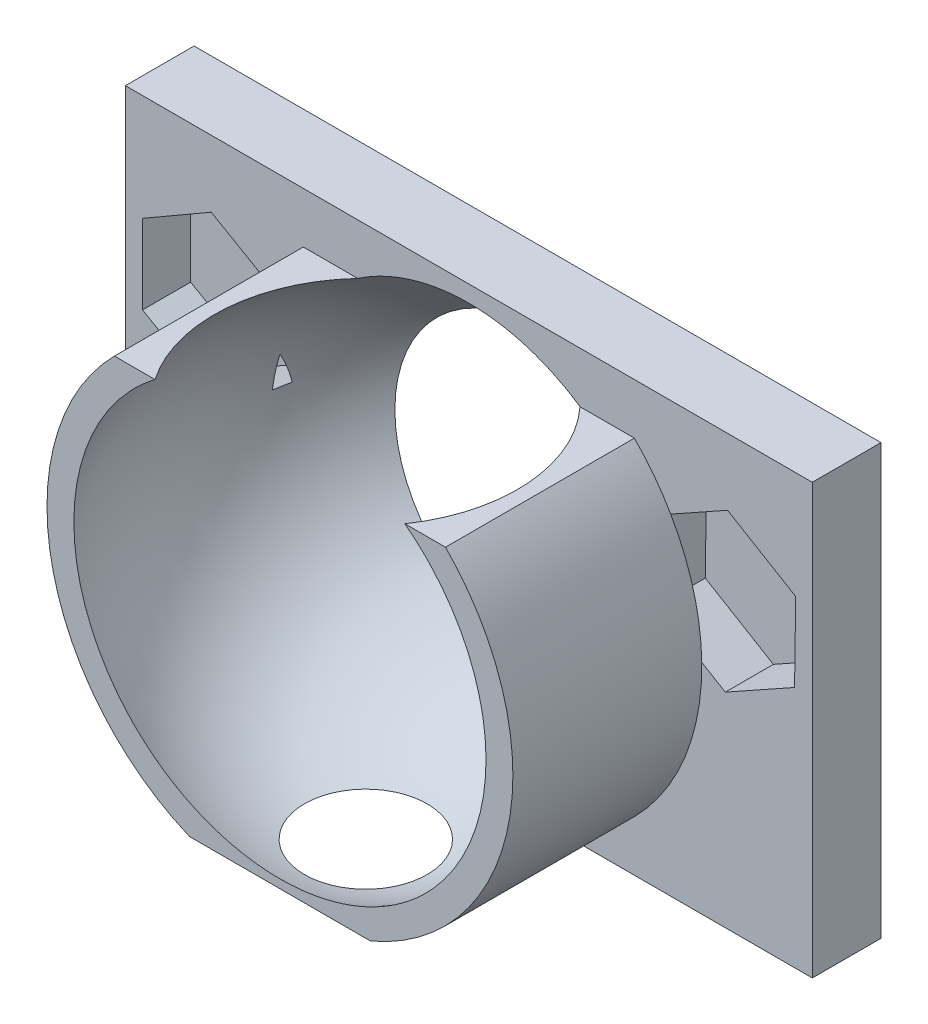
ISO-10303-21;
HEADER;
FILE_DESCRIPTION(('STEP AP214'),'2;1');
FILE_NAME('part.step','',(''),(''),'','','');
FILE_SCHEMA(('AUTOMOTIVE_DESIGN { 1 0 10303 214 1 1 1 1 }'));
ENDSEC;
DATA;
#1=APPLICATION_CONTEXT('core data for automotive mechanical design processes');
#2=APPLICATION_PROTOCOL_DEFINITION('international standard','automotive_design',2000,#1);
#3=PRODUCT_CONTEXT('',#1,'mechanical');
#4=PRODUCT('Part','Part','',(#3));
#5=PRODUCT_RELATED_PRODUCT_CATEGORY('part','',(#4));
#6=PRODUCT_DEFINITION_FORMATION('','',#4);
#7=PRODUCT_DEFINITION_CONTEXT('part definition',#1,'design');
#8=PRODUCT_DEFINITION('design','',#6,#7);
#9=PRODUCT_DEFINITION_SHAPE('','',#8);
#10=(LENGTH_UNIT() NAMED_UNIT(*) SI_UNIT(.MILLI.,.METRE.));
#11=(NAMED_UNIT(*) PLANE_ANGLE_UNIT() SI_UNIT($,.RADIAN.));
#12=(NAMED_UNIT(*) SI_UNIT($,.STERADIAN.) SOLID_ANGLE_UNIT());
#13=UNCERTAINTY_MEASURE_WITH_UNIT(LENGTH_MEASURE(1.E-05),#10,'distance_accuracy_value','');
#14=(GEOMETRIC_REPRESENTATION_CONTEXT(3) GLOBAL_UNCERTAINTY_ASSIGNED_CONTEXT((#13)) GLOBAL_UNIT_ASSIGNED_CONTEXT((#10,
#11,#12)) REPRESENTATION_CONTEXT('',''));
#15=CARTESIAN_POINT('',(0.,0.,0.));
#16=DIRECTION('',(0.,0.,1.));
#17=DIRECTION('',(1.,0.,0.));
#18=AXIS2_PLACEMENT_3D('',#15,#16,#17);
#19=CARTESIAN_POINT('',(29.6392056496232,22.0438836143508,15.));
#20=DIRECTION('',(0.,-1.,0.));
#21=DIRECTION('',(1.,0.,0.));
#22=AXIS2_PLACEMENT_3D('',#19,#20,#21);
#23=PLANE('',#22);
#24=DIRECTION('',(-1.,0.,0.));
#25=VECTOR('',#24,1.);
#26=CARTESIAN_POINT('',(29.6392056496232,22.0438836143508,15.));
#27=LINE('',#26,#25);
#28=CARTESIAN_POINT('',(12.7257793849975,22.0438836143508,15.));
#29=VERTEX_POINT('',#28);
#30=CARTESIAN_POINT('',(10.3607943503768,22.0438836143508,15.));
#31=VERTEX_POINT('',#30);
#32=EDGE_CURVE('E401',#29,#31,#27,.T.);
#33=ORIENTED_EDGE('',*,*,#32,.F.);
#34=CARTESIAN_POINT('',(20.,22.0438836143508,10.));
#35=DIRECTION('',(0.,-1.,0.));
#36=DIRECTION('',(1.,0.,0.));
#37=AXIS2_PLACEMENT_3D('',#34,#35,#36);
#38=CIRCLE('',#37,8.82690690761647);
#39=CARTESIAN_POINT('',(13.5258756919775,22.0438836143508,4.));
#40=VERTEX_POINT('',#39);
#41=EDGE_CURVE('E11',#29,#40,#38,.T.);
#42=ORIENTED_EDGE('',*,*,#41,.T.);
#43=DIRECTION('',(-1.,0.,0.));
#44=VECTOR('',#43,1.);
#45=CARTESIAN_POINT('',(29.6392056496232,22.0438836143508,4.));
#46=LINE('',#45,#44);
#47=CARTESIAN_POINT('',(10.3607943503768,22.0438836143508,4.));
#48=VERTEX_POINT('',#47);
#49=EDGE_CURVE('E224',#40,#48,#46,.T.);
#50=ORIENTED_EDGE('',*,*,#49,.T.);
#51=DIRECTION('',(0.,0.,-1.));
#52=VECTOR('',#51,1.);
#53=CARTESIAN_POINT('',(10.3607943503768,22.0438836143508,15.));
#54=LINE('',#53,#52);
#55=EDGE_CURVE('E240',#31,#48,#54,.T.);
#56=ORIENTED_EDGE('',*,*,#55,.F.);
#57=EDGE_LOOP('',(#33,#42,#50,#56));
#58=FACE_BOUND('',#57,.T.);
#59=ADVANCED_FACE('F35',(#58),#23,.F.);
#60=CARTESIAN_POINT('',(0.,0.,4.));
#61=DIRECTION('',(1.,0.,0.));
#62=DIRECTION('',(0.,0.,-1.));
#63=AXIS2_PLACEMENT_3D('',#60,#61,#62);
#64=PLANE('',#63);
#65=DIRECTION('',(0.,-1.,0.));
#66=VECTOR('',#65,1.);
#67=CARTESIAN_POINT('',(0.,0.,0.));
#68=LINE('',#67,#66);
#69=CARTESIAN_POINT('',(0.,25.,0.));
#70=VERTEX_POINT('',#69);
#71=CARTESIAN_POINT('',(0.,0.,0.));
#72=VERTEX_POINT('',#71);
#73=EDGE_CURVE('E292',#70,#72,#68,.T.);
#74=ORIENTED_EDGE('',*,*,#73,.T.);
#75=DIRECTION('',(0.,0.,-1.));
#76=VECTOR('',#75,1.);
#77=CARTESIAN_POINT('',(0.,0.,4.));
#78=LINE('',#77,#76);
#79=CARTESIAN_POINT('',(0.,0.,4.));
#80=VERTEX_POINT('',#79);
#81=EDGE_CURVE('E382',#80,#72,#78,.T.);
#82=ORIENTED_EDGE('',*,*,#81,.F.);
#83=DIRECTION('',(0.,-1.,0.));
#84=VECTOR('',#83,1.);
#85=CARTESIAN_POINT('',(0.,0.,4.));
#86=LINE('',#85,#84);
#87=CARTESIAN_POINT('',(0.,25.,4.));
#88=VERTEX_POINT('',#87);
#89=EDGE_CURVE('E356',#88,#80,#86,.T.);
#90=ORIENTED_EDGE('',*,*,#89,.F.);
#91=DIRECTION('',(0.,0.,-1.));
#92=VECTOR('',#91,1.);
#93=CARTESIAN_POINT('',(0.,25.,4.));
#94=LINE('',#93,#92);
#95=EDGE_CURVE('E367',#88,#70,#94,.T.);
#96=ORIENTED_EDGE('',*,*,#95,.T.);
#97=EDGE_LOOP('',(#74,#82,#90,#96));
#98=FACE_BOUND('',#97,.T.);
#99=ADVANCED_FACE('F37',(#98),#64,.F.);
#100=CARTESIAN_POINT('',(0.,0.,4.));
#101=DIRECTION('',(0.,1.,0.));
#102=DIRECTION('',(0.,0.,1.));
#103=AXIS2_PLACEMENT_3D('',#100,#101,#102);
#104=PLANE('',#103);
#105=CARTESIAN_POINT('',(20.,0.,10.));
#106=DIRECTION('',(0.,1.,0.));
#107=DIRECTION('',(0.,0.,1.));
#108=AXIS2_PLACEMENT_3D('',#105,#106,#107);
#109=CIRCLE('',#108,3.57071421427142);
#110=CARTESIAN_POINT('',(20.,0.,13.5707142142714));
#111=VERTEX_POINT('',#110);
#112=EDGE_CURVE('E398',#111,#111,#109,.T.);
#113=ORIENTED_EDGE('',*,*,#112,.T.);
#114=EDGE_LOOP('',(#113));
#115=FACE_BOUND('',#114,.T.);
#116=DIRECTION('',(1.,0.,0.));
#117=VECTOR('',#116,1.);
#118=CARTESIAN_POINT('',(0.,0.,0.));
#119=LINE('',#118,#117);
#120=CARTESIAN_POINT('',(40.,0.,0.));
#121=VERTEX_POINT('',#120);
#122=EDGE_CURVE('E370',#72,#121,#119,.T.);
#123=ORIENTED_EDGE('',*,*,#122,.T.);
#124=DIRECTION('',(0.,0.,-1.));
#125=VECTOR('',#124,1.);
#126=CARTESIAN_POINT('',(40.,0.,4.));
#127=LINE('',#126,#125);
#128=CARTESIAN_POINT('',(40.,0.,4.));
#129=VERTEX_POINT('',#128);
#130=EDGE_CURVE('E380',#129,#121,#127,.T.);
#131=ORIENTED_EDGE('',*,*,#130,.F.);
#132=DIRECTION('',(1.,0.,0.));
#133=VECTOR('',#132,1.);
#134=CARTESIAN_POINT('',(0.,0.,4.));
#135=LINE('',#134,#133);
#136=CARTESIAN_POINT('',(25.2678268764264,0.,4.));
#137=VERTEX_POINT('',#136);
#138=EDGE_CURVE('E359',#137,#129,#135,.T.);
#139=ORIENTED_EDGE('',*,*,#138,.F.);
#140=DIRECTION('',(0.,0.,-1.));
#141=VECTOR('',#140,1.);
#142=CARTESIAN_POINT('',(25.2678268764264,0.,15.));
#143=LINE('',#142,#141);
#144=CARTESIAN_POINT('',(25.2678268764264,0.,15.));
#145=VERTEX_POINT('',#144);
#146=EDGE_CURVE('E245',#145,#137,#143,.T.);
#147=ORIENTED_EDGE('',*,*,#146,.F.);
#148=DIRECTION('',(1.,0.,0.));
#149=VECTOR('',#148,1.);
#150=CARTESIAN_POINT('',(14.7321731235736,0.,15.));
#151=LINE('',#150,#149);
#152=CARTESIAN_POINT('',(14.7321731235736,0.,15.));
#153=VERTEX_POINT('',#152);
#154=EDGE_CURVE('E234',#153,#145,#151,.T.);
#155=ORIENTED_EDGE('',*,*,#154,.F.);
#156=DIRECTION('',(0.,0.,-1.));
#157=VECTOR('',#156,1.);
#158=CARTESIAN_POINT('',(14.7321731235736,0.,15.));
#159=LINE('',#158,#157);
#160=CARTESIAN_POINT('',(14.7321731235736,0.,4.));
#161=VERTEX_POINT('',#160);
#162=EDGE_CURVE('E248',#153,#161,#159,.T.);
#163=ORIENTED_EDGE('',*,*,#162,.T.);
#164=EDGE_CURVE('E361',#80,#161,#135,.T.);
#165=ORIENTED_EDGE('',*,*,#164,.F.);
#166=ORIENTED_EDGE('',*,*,#81,.T.);
#167=EDGE_LOOP('',(#123,#131,#139,#147,#155,#163,#165,#166));
#168=FACE_BOUND('',#167,.T.);
#169=ADVANCED_FACE('F440',(#115,#168),#104,.F.);
#170=CARTESIAN_POINT('',(40.,0.,4.));
#171=DIRECTION('',(-1.,0.,0.));
#172=DIRECTION('',(0.,0.,1.));
#173=AXIS2_PLACEMENT_3D('',#170,#171,#172);
#174=PLANE('',#173);
#175=DIRECTION('',(0.,1.,0.));
#176=VECTOR('',#175,1.);
#177=CARTESIAN_POINT('',(40.,0.,0.));
#178=LINE('',#177,#176);
#179=CARTESIAN_POINT('',(40.,25.,0.));
#180=VERTEX_POINT('',#179);
#181=EDGE_CURVE('E372',#121,#180,#178,.T.);
#182=ORIENTED_EDGE('',*,*,#181,.T.);
#183=DIRECTION('',(0.,0.,-1.));
#184=VECTOR('',#183,1.);
#185=CARTESIAN_POINT('',(40.,25.,4.));
#186=LINE('',#185,#184);
#187=CARTESIAN_POINT('',(40.,25.,4.));
#188=VERTEX_POINT('',#187);
#189=EDGE_CURVE('E377',#188,#180,#186,.T.);
#190=ORIENTED_EDGE('',*,*,#189,.F.);
#191=DIRECTION('',(0.,1.,0.));
#192=VECTOR('',#191,1.);
#193=CARTESIAN_POINT('',(40.,0.,4.));
#194=LINE('',#193,#192);
#195=EDGE_CURVE('E363',#129,#188,#194,.T.);
#196=ORIENTED_EDGE('',*,*,#195,.F.);
#197=ORIENTED_EDGE('',*,*,#130,.T.);
#198=EDGE_LOOP('',(#182,#190,#196,#197));
#199=FACE_BOUND('',#198,.T.);
#200=ADVANCED_FACE('F445',(#199),#174,.F.);
#201=CARTESIAN_POINT('',(0.,25.,4.));
#202=DIRECTION('',(0.,-1.,0.));
#203=DIRECTION('',(0.,0.,-1.));
#204=AXIS2_PLACEMENT_3D('',#201,#202,#203);
#205=PLANE('',#204);
#206=DIRECTION('',(-1.,0.,0.));
#207=VECTOR('',#206,1.);
#208=CARTESIAN_POINT('',(0.,25.,0.));
#209=LINE('',#208,#207);
#210=EDGE_CURVE('E360',#180,#70,#209,.T.);
#211=ORIENTED_EDGE('',*,*,#210,.T.);
#212=ORIENTED_EDGE('',*,*,#95,.F.);
#213=DIRECTION('',(-1.,0.,0.));
#214=VECTOR('',#213,1.);
#215=CARTESIAN_POINT('',(0.,25.,4.));
#216=LINE('',#215,#214);
#217=EDGE_CURVE('E365',#188,#88,#216,.T.);
#218=ORIENTED_EDGE('',*,*,#217,.F.);
#219=ORIENTED_EDGE('',*,*,#189,.T.);
#220=EDGE_LOOP('',(#211,#212,#218,#219));
#221=FACE_BOUND('',#220,.T.);
#222=ADVANCED_FACE('F450',(#221),#205,.F.);
#223=CARTESIAN_POINT('',(0.,0.,4.));
#224=DIRECTION('',(0.,0.,-1.));
#225=DIRECTION('',(-1.,0.,0.));
#226=AXIS2_PLACEMENT_3D('',#223,#224,#225);
#227=PLANE('',#226);
#228=ORIENTED_EDGE('',*,*,#49,.F.);
#229=CARTESIAN_POINT('',(20.,12.5,4.));
#230=DIRECTION('',(0.,0.,-1.));
#231=DIRECTION('',(-1.,0.,0.));
#232=AXIS2_PLACEMENT_3D('',#229,#230,#231);
#233=CIRCLE('',#232,11.5325625946708);
#234=CARTESIAN_POINT('',(26.4741243080225,22.0438836143508,4.));
#235=VERTEX_POINT('',#234);
#236=EDGE_CURVE('E210',#40,#235,#233,.T.);
#237=ORIENTED_EDGE('',*,*,#236,.T.);
#238=CARTESIAN_POINT('',(29.6392056496232,22.0438836143508,4.));
#239=VERTEX_POINT('',#238);
#240=EDGE_CURVE('E221',#239,#235,#46,.T.);
#241=ORIENTED_EDGE('',*,*,#240,.F.);
#242=CARTESIAN_POINT('',(20.,12.5,4.));
#243=DIRECTION('',(0.,0.,1.));
#244=DIRECTION('',(1.,0.,0.));
#245=AXIS2_PLACEMENT_3D('',#242,#243,#244);
#246=CIRCLE('',#245,13.5646599662505);
#247=CARTESIAN_POINT('',(31.7542164486944,19.2704058724157,4.));
#248=VERTEX_POINT('',#247);
#249=EDGE_CURVE('E384',#248,#239,#246,.T.);
#250=ORIENTED_EDGE('',*,*,#249,.F.);
#251=DIRECTION('',(-0.873104638193607,-0.487532861215334,0.));
#252=VECTOR('',#251,1.);
#253=CARTESIAN_POINT('',(35.0662173467058,21.1197939108254,4.));
#254=LINE('',#253,#252);
#255=CARTESIAN_POINT('',(35.0662173467058,21.1197939108254,4.));
#256=VERTEX_POINT('',#255);
#257=EDGE_CURVE('E310',#256,#248,#254,.T.);
#258=ORIENTED_EDGE('',*,*,#257,.F.);
#259=DIRECTION('',(-0.858768162088996,0.512364366230017,0.));
#260=VECTOR('',#259,1.);
#261=CARTESIAN_POINT('',(39.0326975831343,18.7532842726968,4.));
#262=LINE('',#261,#260);
#263=CARTESIAN_POINT('',(39.0326975831343,18.7532842726968,4.));
#264=VERTEX_POINT('',#263);
#265=EDGE_CURVE('E337',#264,#256,#262,.T.);
#266=ORIENTED_EDGE('',*,*,#265,.F.);
#267=DIRECTION('',(0.0143364761046099,0.999897227445352,0.));
#268=VECTOR('',#267,1.);
#269=CARTESIAN_POINT('',(38.9664802364285,14.1349568052766,4.));
#270=LINE('',#269,#268);
#271=CARTESIAN_POINT('',(38.9664802364285,14.1349568052766,4.));
#272=VERTEX_POINT('',#271);
#273=EDGE_CURVE('E334',#272,#264,#270,.T.);
#274=ORIENTED_EDGE('',*,*,#273,.F.);
#275=DIRECTION('',(0.873104638193607,0.487532861215335,0.));
#276=VECTOR('',#275,1.);
#277=CARTESIAN_POINT('',(34.9337826532942,11.8831389759849,4.));
#278=LINE('',#277,#276);
#279=CARTESIAN_POINT('',(34.9337826532942,11.8831389759849,4.));
#280=VERTEX_POINT('',#279);
#281=EDGE_CURVE('E331',#280,#272,#278,.T.);
#282=ORIENTED_EDGE('',*,*,#281,.F.);
#283=DIRECTION('',(0.858768162088997,-0.512364366230017,0.));
#284=VECTOR('',#283,1.);
#285=CARTESIAN_POINT('',(30.9673024168657,14.2496486141134,4.));
#286=LINE('',#285,#284);
#287=CARTESIAN_POINT('',(33.5631724292246,12.7008821921464,4.));
#288=VERTEX_POINT('',#287);
#289=EDGE_CURVE('E328',#288,#280,#286,.T.);
#290=ORIENTED_EDGE('',*,*,#289,.F.);
#291=EDGE_CURVE('E236',#137,#288,#246,.T.);
#292=ORIENTED_EDGE('',*,*,#291,.F.);
#293=ORIENTED_EDGE('',*,*,#138,.T.);
#294=ORIENTED_EDGE('',*,*,#195,.T.);
#295=ORIENTED_EDGE('',*,*,#217,.T.);
#296=ORIENTED_EDGE('',*,*,#89,.T.);
#297=ORIENTED_EDGE('',*,*,#164,.T.);
#298=CARTESIAN_POINT('',(20.,12.5,4.));
#299=DIRECTION('',(0.,0.,1.));
#300=DIRECTION('',(1.,0.,0.));
#301=AXIS2_PLACEMENT_3D('',#298,#299,#300);
#302=CIRCLE('',#301,13.5646599662505);
#303=CARTESIAN_POINT('',(6.43697867761824,12.7108378728256,4.));
#304=VERTEX_POINT('',#303);
#305=EDGE_CURVE('E217',#304,#161,#302,.T.);
#306=ORIENTED_EDGE('',*,*,#305,.F.);
#307=DIRECTION('',(0.866025403784438,0.5,0.));
#308=VECTOR('',#307,1.);
#309=CARTESIAN_POINT('',(5.,11.881197846483,4.));
#310=LINE('',#309,#308);
#311=CARTESIAN_POINT('',(5.,11.881197846483,4.));
#312=VERTEX_POINT('',#311);
#313=EDGE_CURVE('E276',#312,#304,#310,.T.);
#314=ORIENTED_EDGE('',*,*,#313,.F.);
#315=DIRECTION('',(0.866025403784439,-0.499999999999999,0.));
#316=VECTOR('',#315,1.);
#317=CARTESIAN_POINT('',(0.999999999999996,14.1905989232415,4.));
#318=LINE('',#317,#316);
#319=CARTESIAN_POINT('',(0.999999999999996,14.1905989232415,4.));
#320=VERTEX_POINT('',#319);
#321=EDGE_CURVE('E272',#320,#312,#318,.T.);
#322=ORIENTED_EDGE('',*,*,#321,.F.);
#323=DIRECTION('',(0.,-1.,0.));
#324=VECTOR('',#323,1.);
#325=CARTESIAN_POINT('',(0.999999999999996,18.8094010767585,4.));
#326=LINE('',#325,#324);
#327=CARTESIAN_POINT('',(0.999999999999996,18.8094010767585,4.));
#328=VERTEX_POINT('',#327);
#329=EDGE_CURVE('E256',#328,#320,#326,.T.);
#330=ORIENTED_EDGE('',*,*,#329,.F.);
#331=DIRECTION('',(-0.866025403784438,-0.5,0.));
#332=VECTOR('',#331,1.);
#333=CARTESIAN_POINT('',(5.,21.118802153517,4.));
#334=LINE('',#333,#332);
#335=CARTESIAN_POINT('',(5.,21.118802153517,4.));
#336=VERTEX_POINT('',#335);
#337=EDGE_CURVE('E285',#336,#328,#334,.T.);
#338=ORIENTED_EDGE('',*,*,#337,.F.);
#339=DIRECTION('',(-0.866025403784439,0.5,0.));
#340=VECTOR('',#339,1.);
#341=CARTESIAN_POINT('',(9.,18.8094010767585,4.));
#342=LINE('',#341,#340);
#343=CARTESIAN_POINT('',(8.2347518210157,19.251217318892,4.));
#344=VERTEX_POINT('',#343);
#345=EDGE_CURVE('E281',#344,#336,#342,.T.);
#346=ORIENTED_EDGE('',*,*,#345,.F.);
#347=EDGE_CURVE('E391',#48,#344,#302,.T.);
#348=ORIENTED_EDGE('',*,*,#347,.F.);
#349=EDGE_LOOP('',(#228,#237,#241,#250,#258,#266,#274,#282,#290,#292,#293,#294,#295,#296,#297,
#306,#314,#322,#330,#338,#346,#348));
#350=FACE_BOUND('',#349,.T.);
#351=ADVANCED_FACE('F220',(#350),#227,.F.);
#352=CARTESIAN_POINT('',(0.,0.,0.));
#353=DIRECTION('',(0.,0.,-1.));
#354=DIRECTION('',(-1.,0.,0.));
#355=AXIS2_PLACEMENT_3D('',#352,#353,#354);
#356=PLANE('',#355);
#357=CARTESIAN_POINT('',(20.,12.5,0.));
#358=DIRECTION('',(0.,0.,-1.));
#359=DIRECTION('',(-1.,0.,0.));
#360=AXIS2_PLACEMENT_3D('',#357,#358,#359);
#361=CIRCLE('',#360,8.30662386291808);
#362=CARTESIAN_POINT('',(11.6933761370819,12.5,0.));
#363=VERTEX_POINT('',#362);
#364=EDGE_CURVE('E407',#363,#363,#361,.T.);
#365=ORIENTED_EDGE('',*,*,#364,.F.);
#366=EDGE_LOOP('',(#365));
#367=FACE_BOUND('',#366,.T.);
#368=ORIENTED_EDGE('',*,*,#73,.F.);
#369=ORIENTED_EDGE('',*,*,#210,.F.);
#370=ORIENTED_EDGE('',*,*,#181,.F.);
#371=ORIENTED_EDGE('',*,*,#122,.F.);
#372=EDGE_LOOP('',(#368,#369,#370,#371));
#373=FACE_BOUND('',#372,.T.);
#374=ADVANCED_FACE('F455',(#367,#373),#356,.T.);
#375=CARTESIAN_POINT('',(31.0335197635715,18.8679760815337,1.2));
#376=DIRECTION('',(-0.999897227445352,0.0143364761046099,0.));
#377=DIRECTION('',(-0.0143364761046099,-0.999897227445352,0.));
#378=AXIS2_PLACEMENT_3D('',#375,#376,#377);
#379=PLANE('',#378);
#380=DIRECTION('',(-0.0143364761046099,-0.999897227445352,0.));
#381=VECTOR('',#380,1.);
#382=CARTESIAN_POINT('',(31.0335197635715,18.8679760815337,4.));
#383=LINE('',#382,#381);
#384=CARTESIAN_POINT('',(31.0335197635715,18.8679760815337,4.));
#385=VERTEX_POINT('',#384);
#386=CARTESIAN_POINT('',(30.9922362609728,15.9886590522657,4.));
#387=VERTEX_POINT('',#386);
#388=EDGE_CURVE('E251',#385,#387,#383,.T.);
#389=ORIENTED_EDGE('',*,*,#388,.T.);
#390=CARTESIAN_POINT('',(30.9399670397086,12.3431433033866,10.));
#391=DIRECTION('',(-0.999897227445352,0.0143364761046099,0.));
#392=DIRECTION('',(-0.0143364761046099,-0.999897227445352,0.));
#393=AXIS2_PLACEMENT_3D('',#390,#391,#392);
#394=CIRCLE('',#393,7.02086299159991);
#395=CARTESIAN_POINT('',(30.9673024168657,14.2496486141134,3.24300307650336));
#396=VERTEX_POINT('',#395);
#397=EDGE_CURVE('E58',#387,#396,#394,.T.);
#398=ORIENTED_EDGE('',*,*,#397,.T.);
#399=DIRECTION('',(0.,0.,1.));
#400=VECTOR('',#399,1.);
#401=CARTESIAN_POINT('',(30.9673024168657,14.2496486141134,1.2));
#402=LINE('',#401,#400);
#403=CARTESIAN_POINT('',(30.9673024168657,14.2496486141134,1.2));
#404=VERTEX_POINT('',#403);
#405=EDGE_CURVE('E325',#404,#396,#402,.T.);
#406=ORIENTED_EDGE('',*,*,#405,.F.);
#407=DIRECTION('',(-0.0143364761046099,-0.999897227445352,0.));
#408=VECTOR('',#407,1.);
#409=CARTESIAN_POINT('',(31.0335197635715,18.8679760815337,1.2));
#410=LINE('',#409,#408);
#411=CARTESIAN_POINT('',(31.0335197635715,18.8679760815337,1.2));
#412=VERTEX_POINT('',#411);
#413=EDGE_CURVE('E306',#412,#404,#410,.T.);
#414=ORIENTED_EDGE('',*,*,#413,.F.);
#415=DIRECTION('',(0.,0.,1.));
#416=VECTOR('',#415,1.);
#417=CARTESIAN_POINT('',(31.0335197635715,18.8679760815337,1.2));
#418=LINE('',#417,#416);
#419=EDGE_CURVE('E275',#412,#385,#418,.T.);
#420=ORIENTED_EDGE('',*,*,#419,.T.);
#421=EDGE_LOOP('',(#389,#398,#406,#414,#420));
#422=FACE_BOUND('',#421,.T.);
#423=ADVANCED_FACE('F427',(#422),#379,.F.);
#424=CARTESIAN_POINT('',(35.0662173467058,21.1197939108254,1.2));
#425=DIRECTION('',(-0.487532861215334,0.873104638193607,0.));
#426=DIRECTION('',(-0.873104638193607,-0.487532861215334,0.));
#427=AXIS2_PLACEMENT_3D('',#424,#425,#426);
#428=PLANE('',#427);
#429=ORIENTED_EDGE('',*,*,#257,.T.);
#430=EDGE_CURVE('E340',#248,#385,#254,.T.);
#431=ORIENTED_EDGE('',*,*,#430,.T.);
#432=ORIENTED_EDGE('',*,*,#419,.F.);
#433=DIRECTION('',(-0.873104638193607,-0.487532861215334,0.));
#434=VECTOR('',#433,1.);
#435=CARTESIAN_POINT('',(35.0662173467058,21.1197939108254,1.2));
#436=LINE('',#435,#434);
#437=CARTESIAN_POINT('',(35.0662173467058,21.1197939108254,1.2));
#438=VERTEX_POINT('',#437);
#439=EDGE_CURVE('E322',#438,#412,#436,.T.);
#440=ORIENTED_EDGE('',*,*,#439,.F.);
#441=DIRECTION('',(0.,0.,1.));
#442=VECTOR('',#441,1.);
#443=CARTESIAN_POINT('',(35.0662173467058,21.1197939108254,1.2));
#444=LINE('',#443,#442);
#445=EDGE_CURVE('E345',#438,#256,#444,.T.);
#446=ORIENTED_EDGE('',*,*,#445,.T.);
#447=EDGE_LOOP('',(#429,#431,#432,#440,#446));
#448=FACE_BOUND('',#447,.T.);
#449=ADVANCED_FACE('F431',(#448),#428,.F.);
#450=CARTESIAN_POINT('',(39.0326975831343,18.7532842726968,1.2));
#451=DIRECTION('',(0.512364366230017,0.858768162088997,0.));
#452=DIRECTION('',(-0.858768162088997,0.512364366230017,0.));
#453=AXIS2_PLACEMENT_3D('',#450,#451,#452);
#454=PLANE('',#453);
#455=ORIENTED_EDGE('',*,*,#265,.T.);
#456=ORIENTED_EDGE('',*,*,#445,.F.);
#457=DIRECTION('',(-0.858768162088996,0.512364366230017,0.));
#458=VECTOR('',#457,1.);
#459=CARTESIAN_POINT('',(39.0326975831343,18.7532842726968,1.2));
#460=LINE('',#459,#458);
#461=CARTESIAN_POINT('',(39.0326975831343,18.7532842726968,1.2));
#462=VERTEX_POINT('',#461);
#463=EDGE_CURVE('E319',#462,#438,#460,.T.);
#464=ORIENTED_EDGE('',*,*,#463,.F.);
#465=DIRECTION('',(0.,0.,1.));
#466=VECTOR('',#465,1.);
#467=CARTESIAN_POINT('',(39.0326975831343,18.7532842726968,1.2));
#468=LINE('',#467,#466);
#469=EDGE_CURVE('E347',#462,#264,#468,.T.);
#470=ORIENTED_EDGE('',*,*,#469,.T.);
#471=EDGE_LOOP('',(#455,#456,#464,#470));
#472=FACE_BOUND('',#471,.T.);
#473=ADVANCED_FACE('F524',(#472),#454,.F.);
#474=CARTESIAN_POINT('',(38.9664802364285,14.1349568052766,1.2));
#475=DIRECTION('',(0.999897227445352,-0.0143364761046099,0.));
#476=DIRECTION('',(0.0143364761046099,0.999897227445352,0.));
#477=AXIS2_PLACEMENT_3D('',#474,#475,#476);
#478=PLANE('',#477);
#479=ORIENTED_EDGE('',*,*,#273,.T.);
#480=ORIENTED_EDGE('',*,*,#469,.F.);
#481=DIRECTION('',(0.0143364761046099,0.999897227445352,0.));
#482=VECTOR('',#481,1.);
#483=CARTESIAN_POINT('',(38.9664802364285,14.1349568052766,1.2));
#484=LINE('',#483,#482);
#485=CARTESIAN_POINT('',(38.9664802364285,14.1349568052766,1.2));
#486=VERTEX_POINT('',#485);
#487=EDGE_CURVE('E316',#486,#462,#484,.T.);
#488=ORIENTED_EDGE('',*,*,#487,.F.);
#489=DIRECTION('',(0.,0.,1.));
#490=VECTOR('',#489,1.);
#491=CARTESIAN_POINT('',(38.9664802364285,14.1349568052766,1.2));
#492=LINE('',#491,#490);
#493=EDGE_CURVE('E349',#486,#272,#492,.T.);
#494=ORIENTED_EDGE('',*,*,#493,.T.);
#495=EDGE_LOOP('',(#479,#480,#488,#494));
#496=FACE_BOUND('',#495,.T.);
#497=ADVANCED_FACE('F527',(#496),#478,.F.);
#498=CARTESIAN_POINT('',(34.9337826532942,11.8831389759849,1.2));
#499=DIRECTION('',(0.487532861215335,-0.873104638193607,0.));
#500=DIRECTION('',(0.873104638193607,0.487532861215335,0.));
#501=AXIS2_PLACEMENT_3D('',#498,#499,#500);
#502=PLANE('',#501);
#503=ORIENTED_EDGE('',*,*,#281,.T.);
#504=ORIENTED_EDGE('',*,*,#493,.F.);
#505=DIRECTION('',(0.873104638193607,0.487532861215335,0.));
#506=VECTOR('',#505,1.);
#507=CARTESIAN_POINT('',(34.9337826532942,11.8831389759849,1.2));
#508=LINE('',#507,#506);
#509=CARTESIAN_POINT('',(34.9337826532942,11.8831389759849,1.2));
#510=VERTEX_POINT('',#509);
#511=EDGE_CURVE('E313',#510,#486,#508,.T.);
#512=ORIENTED_EDGE('',*,*,#511,.F.);
#513=DIRECTION('',(0.,0.,1.));
#514=VECTOR('',#513,1.);
#515=CARTESIAN_POINT('',(34.9337826532942,11.8831389759849,1.2));
#516=LINE('',#515,#514);
#517=EDGE_CURVE('E351',#510,#280,#516,.T.);
#518=ORIENTED_EDGE('',*,*,#517,.T.);
#519=EDGE_LOOP('',(#503,#504,#512,#518));
#520=FACE_BOUND('',#519,.T.);
#521=ADVANCED_FACE('F531',(#520),#502,.F.);
#522=CARTESIAN_POINT('',(30.9673024168657,14.2496486141134,1.2));
#523=DIRECTION('',(-0.512364366230017,-0.858768162088997,0.));
#524=DIRECTION('',(0.858768162088997,-0.512364366230017,0.));
#525=AXIS2_PLACEMENT_3D('',#522,#523,#524);
#526=PLANE('',#525);
#527=ORIENTED_EDGE('',*,*,#405,.T.);
#528=CARTESIAN_POINT('',(23.6489552505751,18.6159729298478,10.));
#529=DIRECTION('',(-0.512364366230017,-0.858768162088997,0.));
#530=DIRECTION('',(0.858768162088997,-0.512364366230017,0.));
#531=AXIS2_PLACEMENT_3D('',#528,#529,#530);
#532=CIRCLE('',#531,10.8756609316707);
#533=CARTESIAN_POINT('',(31.4386973322056,13.9684016283674,4.));
#534=VERTEX_POINT('',#533);
#535=EDGE_CURVE('E417',#396,#534,#532,.T.);
#536=ORIENTED_EDGE('',*,*,#535,.T.);
#537=EDGE_CURVE('E329',#534,#288,#286,.T.);
#538=ORIENTED_EDGE('',*,*,#537,.T.);
#539=ORIENTED_EDGE('',*,*,#289,.T.);
#540=ORIENTED_EDGE('',*,*,#517,.F.);
#541=DIRECTION('',(0.858768162088997,-0.512364366230017,0.));
#542=VECTOR('',#541,1.);
#543=CARTESIAN_POINT('',(30.9673024168657,14.2496486141134,1.2));
#544=LINE('',#543,#542);
#545=EDGE_CURVE('E309',#404,#510,#544,.T.);
#546=ORIENTED_EDGE('',*,*,#545,.F.);
#547=EDGE_LOOP('',(#527,#536,#538,#539,#540,#546));
#548=FACE_BOUND('',#547,.T.);
#549=ADVANCED_FACE('F520',(#548),#526,.F.);
#550=CARTESIAN_POINT('',(0.,0.,1.2));
#551=DIRECTION('',(0.,0.,1.));
#552=DIRECTION('',(1.,0.,0.));
#553=AXIS2_PLACEMENT_3D('',#550,#551,#552);
#554=PLANE('',#553);
#555=ORIENTED_EDGE('',*,*,#413,.T.);
#556=ORIENTED_EDGE('',*,*,#545,.T.);
#557=ORIENTED_EDGE('',*,*,#511,.T.);
#558=ORIENTED_EDGE('',*,*,#487,.T.);
#559=ORIENTED_EDGE('',*,*,#463,.T.);
#560=ORIENTED_EDGE('',*,*,#439,.T.);
#561=EDGE_LOOP('',(#555,#556,#557,#558,#559,#560));
#562=FACE_BOUND('',#561,.T.);
#563=ADVANCED_FACE('F516',(#562),#554,.T.);
#564=CARTESIAN_POINT('',(0.999999999999996,14.1905989232415,1.2));
#565=DIRECTION('',(-0.499999999999999,-0.866025403784439,0.));
#566=DIRECTION('',(0.866025403784439,-0.499999999999999,0.));
#567=AXIS2_PLACEMENT_3D('',#564,#565,#566);
#568=PLANE('',#567);
#569=ORIENTED_EDGE('',*,*,#321,.T.);
#570=DIRECTION('',(0.,0.,1.));
#571=VECTOR('',#570,1.);
#572=CARTESIAN_POINT('',(5.,11.881197846483,1.2));
#573=LINE('',#572,#571);
#574=CARTESIAN_POINT('',(5.,11.881197846483,1.2));
#575=VERTEX_POINT('',#574);
#576=EDGE_CURVE('E271',#575,#312,#573,.T.);
#577=ORIENTED_EDGE('',*,*,#576,.F.);
#578=DIRECTION('',(0.866025403784439,-0.499999999999999,0.));
#579=VECTOR('',#578,1.);
#580=CARTESIAN_POINT('',(0.999999999999996,14.1905989232415,1.2));
#581=LINE('',#580,#579);
#582=CARTESIAN_POINT('',(0.999999999999996,14.1905989232415,1.2));
#583=VERTEX_POINT('',#582);
#584=EDGE_CURVE('E252',#583,#575,#581,.T.);
#585=ORIENTED_EDGE('',*,*,#584,.F.);
#586=DIRECTION('',(0.,0.,1.));
#587=VECTOR('',#586,1.);
#588=CARTESIAN_POINT('',(0.999999999999996,14.1905989232415,1.2));
#589=LINE('',#588,#587);
#590=EDGE_CURVE('E290',#583,#320,#589,.T.);
#591=ORIENTED_EDGE('',*,*,#590,.T.);
#592=EDGE_LOOP('',(#569,#577,#585,#591));
#593=FACE_BOUND('',#592,.T.);
#594=ADVANCED_FACE('F498',(#593),#568,.F.);
#595=CARTESIAN_POINT('',(0.999999999999996,18.8094010767585,1.2));
#596=DIRECTION('',(-1.,0.,0.));
#597=DIRECTION('',(0.,-1.,0.));
#598=AXIS2_PLACEMENT_3D('',#595,#596,#597);
#599=PLANE('',#598);
#600=ORIENTED_EDGE('',*,*,#329,.T.);
#601=ORIENTED_EDGE('',*,*,#590,.F.);
#602=DIRECTION('',(0.,-1.,0.));
#603=VECTOR('',#602,1.);
#604=CARTESIAN_POINT('',(0.999999999999996,18.8094010767585,1.2));
#605=LINE('',#604,#603);
#606=CARTESIAN_POINT('',(0.999999999999996,18.8094010767585,1.2));
#607=VERTEX_POINT('',#606);
#608=EDGE_CURVE('E268',#607,#583,#605,.T.);
#609=ORIENTED_EDGE('',*,*,#608,.F.);
#610=DIRECTION('',(0.,0.,1.));
#611=VECTOR('',#610,1.);
#612=CARTESIAN_POINT('',(0.999999999999996,18.8094010767585,1.2));
#613=LINE('',#612,#611);
#614=EDGE_CURVE('E293',#607,#328,#613,.T.);
#615=ORIENTED_EDGE('',*,*,#614,.T.);
#616=EDGE_LOOP('',(#600,#601,#609,#615));
#617=FACE_BOUND('',#616,.T.);
#618=ADVANCED_FACE('F494',(#617),#599,.F.);
#619=CARTESIAN_POINT('',(5.,21.118802153517,1.2));
#620=DIRECTION('',(-0.5,0.866025403784438,0.));
#621=DIRECTION('',(-0.866025403784439,-0.5,0.));
#622=AXIS2_PLACEMENT_3D('',#619,#620,#621);
#623=PLANE('',#622);
#624=ORIENTED_EDGE('',*,*,#337,.T.);
#625=ORIENTED_EDGE('',*,*,#614,.F.);
#626=DIRECTION('',(-0.866025403784438,-0.5,0.));
#627=VECTOR('',#626,1.);
#628=CARTESIAN_POINT('',(5.,21.118802153517,1.2));
#629=LINE('',#628,#627);
#630=CARTESIAN_POINT('',(5.,21.118802153517,1.2));
#631=VERTEX_POINT('',#630);
#632=EDGE_CURVE('E265',#631,#607,#629,.T.);
#633=ORIENTED_EDGE('',*,*,#632,.F.);
#634=DIRECTION('',(0.,0.,1.));
#635=VECTOR('',#634,1.);
#636=CARTESIAN_POINT('',(5.,21.118802153517,1.2));
#637=LINE('',#636,#635);
#638=EDGE_CURVE('E295',#631,#336,#637,.T.);
#639=ORIENTED_EDGE('',*,*,#638,.T.);
#640=EDGE_LOOP('',(#624,#625,#633,#639));
#641=FACE_BOUND('',#640,.T.);
#642=ADVANCED_FACE('F497',(#641),#623,.F.);
#643=CARTESIAN_POINT('',(9.,18.8094010767585,1.2));
#644=DIRECTION('',(0.5,0.866025403784439,0.));
#645=DIRECTION('',(-0.866025403784439,0.5,0.));
#646=AXIS2_PLACEMENT_3D('',#643,#644,#645);
#647=PLANE('',#646);
#648=CARTESIAN_POINT('',(9.,18.8094010767585,4.));
#649=VERTEX_POINT('',#648);
#650=EDGE_CURVE('E282',#649,#344,#342,.T.);
#651=ORIENTED_EDGE('',*,*,#650,.T.);
#652=ORIENTED_EDGE('',*,*,#345,.T.);
#653=ORIENTED_EDGE('',*,*,#638,.F.);
#654=DIRECTION('',(-0.866025403784439,0.5,0.));
#655=VECTOR('',#654,1.);
#656=CARTESIAN_POINT('',(9.,18.8094010767585,1.2));
#657=LINE('',#656,#655);
#658=CARTESIAN_POINT('',(9.,18.8094010767585,1.2));
#659=VERTEX_POINT('',#658);
#660=EDGE_CURVE('E262',#659,#631,#657,.T.);
#661=ORIENTED_EDGE('',*,*,#660,.F.);
#662=DIRECTION('',(0.,0.,1.));
#663=VECTOR('',#662,1.);
#664=CARTESIAN_POINT('',(9.,18.8094010767585,1.2));
#665=LINE('',#664,#663);
#666=EDGE_CURVE('E298',#659,#649,#665,.T.);
#667=ORIENTED_EDGE('',*,*,#666,.T.);
#668=EDGE_LOOP('',(#651,#652,#653,#661,#667));
#669=FACE_BOUND('',#668,.T.);
#670=ADVANCED_FACE('F502',(#669),#647,.F.);
#671=CARTESIAN_POINT('',(9.,14.1905989232415,1.2));
#672=DIRECTION('',(1.,0.,0.));
#673=DIRECTION('',(0.,0.,-1.));
#674=AXIS2_PLACEMENT_3D('',#671,#672,#673);
#675=PLANE('',#674);
#676=DIRECTION('',(0.,0.,1.));
#677=VECTOR('',#676,1.);
#678=CARTESIAN_POINT('',(9.,14.1905989232415,1.2));
#679=LINE('',#678,#677);
#680=CARTESIAN_POINT('',(9.,14.1905989232415,1.2));
#681=VERTEX_POINT('',#680);
#682=CARTESIAN_POINT('',(9.,14.1905989232415,3.28122963030178));
#683=VERTEX_POINT('',#682);
#684=EDGE_CURVE('E301',#681,#683,#679,.T.);
#685=ORIENTED_EDGE('',*,*,#684,.T.);
#686=CARTESIAN_POINT('',(9.,12.5,10.));
#687=DIRECTION('',(1.,0.,0.));
#688=DIRECTION('',(0.,0.,-1.));
#689=AXIS2_PLACEMENT_3D('',#686,#687,#688);
#690=CIRCLE('',#689,6.92820323027551);
#691=CARTESIAN_POINT('',(9.,15.9641016151378,4.));
#692=VERTEX_POINT('',#691);
#693=EDGE_CURVE('E410',#683,#692,#690,.T.);
#694=ORIENTED_EDGE('',*,*,#693,.T.);
#695=DIRECTION('',(0.,1.,0.));
#696=VECTOR('',#695,1.);
#697=CARTESIAN_POINT('',(9.,14.1905989232415,4.));
#698=LINE('',#697,#696);
#699=EDGE_CURVE('E279',#692,#649,#698,.T.);
#700=ORIENTED_EDGE('',*,*,#699,.T.);
#701=ORIENTED_EDGE('',*,*,#666,.F.);
#702=DIRECTION('',(0.,1.,0.));
#703=VECTOR('',#702,1.);
#704=CARTESIAN_POINT('',(9.,14.1905989232415,1.2));
#705=LINE('',#704,#703);
#706=EDGE_CURVE('E259',#681,#659,#705,.T.);
#707=ORIENTED_EDGE('',*,*,#706,.F.);
#708=EDGE_LOOP('',(#685,#694,#700,#701,#707));
#709=FACE_BOUND('',#708,.T.);
#710=ADVANCED_FACE('F506',(#709),#675,.F.);
#711=CARTESIAN_POINT('',(5.,11.881197846483,1.2));
#712=DIRECTION('',(0.5,-0.866025403784438,0.));
#713=DIRECTION('',(0.866025403784439,0.5,0.));
#714=AXIS2_PLACEMENT_3D('',#711,#712,#713);
#715=PLANE('',#714);
#716=CARTESIAN_POINT('',(8.55704682394758,13.9348597878092,4.));
#717=VERTEX_POINT('',#716);
#718=EDGE_CURVE('E274',#304,#717,#310,.T.);
#719=ORIENTED_EDGE('',*,*,#718,.T.);
#720=CARTESIAN_POINT('',(16.5179491924311,18.5310889132455,10.));
#721=DIRECTION('',(0.5,-0.866025403784438,0.));
#722=DIRECTION('',(0.866025403784439,0.5,0.));
#723=AXIS2_PLACEMENT_3D('',#720,#721,#722);
#724=CIRCLE('',#723,10.977307898298);
#725=EDGE_CURVE('E50',#717,#683,#724,.T.);
#726=ORIENTED_EDGE('',*,*,#725,.T.);
#727=ORIENTED_EDGE('',*,*,#684,.F.);
#728=DIRECTION('',(0.866025403784438,0.5,0.));
#729=VECTOR('',#728,1.);
#730=CARTESIAN_POINT('',(5.,11.881197846483,1.2));
#731=LINE('',#730,#729);
#732=EDGE_CURVE('E255',#575,#681,#731,.T.);
#733=ORIENTED_EDGE('',*,*,#732,.F.);
#734=ORIENTED_EDGE('',*,*,#576,.T.);
#735=ORIENTED_EDGE('',*,*,#313,.T.);
#736=EDGE_LOOP('',(#719,#726,#727,#733,#734,#735));
#737=FACE_BOUND('',#736,.T.);
#738=ADVANCED_FACE('F492',(#737),#715,.F.);
#739=CARTESIAN_POINT('',(0.,0.,1.2));
#740=DIRECTION('',(0.,0.,1.));
#741=DIRECTION('',(1.,0.,0.));
#742=AXIS2_PLACEMENT_3D('',#739,#740,#741);
#743=PLANE('',#742);
#744=ORIENTED_EDGE('',*,*,#584,.T.);
#745=ORIENTED_EDGE('',*,*,#732,.T.);
#746=ORIENTED_EDGE('',*,*,#706,.T.);
#747=ORIENTED_EDGE('',*,*,#660,.T.);
#748=ORIENTED_EDGE('',*,*,#632,.T.);
#749=ORIENTED_EDGE('',*,*,#608,.T.);
#750=EDGE_LOOP('',(#744,#745,#746,#747,#748,#749));
#751=FACE_BOUND('',#750,.T.);
#752=ADVANCED_FACE('F488',(#751),#743,.T.);
#753=CARTESIAN_POINT('',(20.,12.5,4.));
#754=DIRECTION('',(0.,0.,1.));
#755=DIRECTION('',(1.,0.,0.));
#756=AXIS2_PLACEMENT_3D('',#753,#754,#755);
#757=PLANE('',#756);
#758=ORIENTED_EDGE('',*,*,#699,.F.);
#759=CARTESIAN_POINT('',(20.,12.5,4.));
#760=DIRECTION('',(0.,0.,1.));
#761=DIRECTION('',(1.,0.,0.));
#762=AXIS2_PLACEMENT_3D('',#759,#760,#761);
#763=CIRCLE('',#762,11.5325625946708);
#764=EDGE_CURVE('E414',#692,#717,#763,.T.);
#765=ORIENTED_EDGE('',*,*,#764,.T.);
#766=ORIENTED_EDGE('',*,*,#718,.F.);
#767=EDGE_CURVE('E392',#344,#304,#302,.T.);
#768=ORIENTED_EDGE('',*,*,#767,.F.);
#769=ORIENTED_EDGE('',*,*,#650,.F.);
#770=EDGE_LOOP('',(#758,#765,#766,#768,#769));
#771=FACE_BOUND('',#770,.T.);
#772=ADVANCED_FACE('F491',(#771),#757,.F.);
#773=CARTESIAN_POINT('',(20.,12.5,15.));
#774=DIRECTION('',(0.,0.,1.));
#775=DIRECTION('',(1.,0.,0.));
#776=AXIS2_PLACEMENT_3D('',#773,#774,#775);
#777=PLANE('',#776);
#778=CARTESIAN_POINT('',(20.,12.5,15.));
#779=DIRECTION('',(0.,0.,1.));
#780=DIRECTION('',(1.,0.,0.));
#781=AXIS2_PLACEMENT_3D('',#778,#779,#780);
#782=CIRCLE('',#781,12.);
#783=CARTESIAN_POINT('',(27.2742206150025,22.0438836143508,15.));
#784=VERTEX_POINT('',#783);
#785=EDGE_CURVE('E212',#29,#784,#782,.T.);
#786=ORIENTED_EDGE('',*,*,#785,.F.);
#787=ORIENTED_EDGE('',*,*,#32,.T.);
#788=CARTESIAN_POINT('',(20.,12.5,15.));
#789=DIRECTION('',(0.,0.,1.));
#790=DIRECTION('',(1.,0.,0.));
#791=AXIS2_PLACEMENT_3D('',#788,#789,#790);
#792=CIRCLE('',#791,13.5646599662505);
#793=EDGE_CURVE('E231',#31,#153,#792,.T.);
#794=ORIENTED_EDGE('',*,*,#793,.T.);
#795=ORIENTED_EDGE('',*,*,#154,.T.);
#796=CARTESIAN_POINT('',(20.,12.5,15.));
#797=DIRECTION('',(0.,0.,1.));
#798=DIRECTION('',(1.,0.,0.));
#799=AXIS2_PLACEMENT_3D('',#796,#797,#798);
#800=CIRCLE('',#799,13.5646599662505);
#801=CARTESIAN_POINT('',(29.6392056496232,22.0438836143508,15.));
#802=VERTEX_POINT('',#801);
#803=EDGE_CURVE('E402',#145,#802,#800,.T.);
#804=ORIENTED_EDGE('',*,*,#803,.T.);
#805=EDGE_CURVE('E243',#802,#784,#27,.T.);
#806=ORIENTED_EDGE('',*,*,#805,.T.);
#807=EDGE_LOOP('',(#786,#787,#794,#795,#804,#806));
#808=FACE_BOUND('',#807,.T.);
#809=ADVANCED_FACE('F589',(#808),#777,.T.);
#810=ORIENTED_EDGE('',*,*,#537,.F.);
#811=CARTESIAN_POINT('',(20.,12.5,4.));
#812=DIRECTION('',(0.,0.,1.));
#813=DIRECTION('',(1.,0.,0.));
#814=AXIS2_PLACEMENT_3D('',#811,#812,#813);
#815=CIRCLE('',#814,11.5325625946708);
#816=EDGE_CURVE('E225',#534,#387,#815,.T.);
#817=ORIENTED_EDGE('',*,*,#816,.T.);
#818=ORIENTED_EDGE('',*,*,#388,.F.);
#819=ORIENTED_EDGE('',*,*,#430,.F.);
#820=EDGE_CURVE('E387',#288,#248,#246,.T.);
#821=ORIENTED_EDGE('',*,*,#820,.F.);
#822=EDGE_LOOP('',(#810,#817,#818,#819,#821));
#823=FACE_BOUND('',#822,.T.);
#824=ADVANCED_FACE('F424',(#823),#757,.F.);
#825=CARTESIAN_POINT('',(20.,12.5,15.));
#826=DIRECTION('',(0.,0.,-1.));
#827=DIRECTION('',(-1.,0.,0.));
#828=AXIS2_PLACEMENT_3D('',#825,#826,#827);
#829=CYLINDRICAL_SURFACE('',#828,13.5646599662505);
#830=ORIENTED_EDGE('',*,*,#347,.T.);
#831=ORIENTED_EDGE('',*,*,#767,.T.);
#832=ORIENTED_EDGE('',*,*,#305,.T.);
#833=ORIENTED_EDGE('',*,*,#162,.F.);
#834=ORIENTED_EDGE('',*,*,#793,.F.);
#835=ORIENTED_EDGE('',*,*,#55,.T.);
#836=EDGE_LOOP('',(#830,#831,#832,#833,#834,#835));
#837=FACE_BOUND('',#836,.T.);
#838=ADVANCED_FACE('F482',(#837),#829,.T.);
#839=CARTESIAN_POINT('',(20.,12.5,15.));
#840=DIRECTION('',(0.,0.,-1.));
#841=DIRECTION('',(-1.,0.,0.));
#842=AXIS2_PLACEMENT_3D('',#839,#840,#841);
#843=CYLINDRICAL_SURFACE('',#842,13.5646599662505);
#844=ORIENTED_EDGE('',*,*,#291,.T.);
#845=ORIENTED_EDGE('',*,*,#820,.T.);
#846=ORIENTED_EDGE('',*,*,#249,.T.);
#847=DIRECTION('',(0.,0.,-1.));
#848=VECTOR('',#847,1.);
#849=CARTESIAN_POINT('',(29.6392056496232,22.0438836143508,15.));
#850=LINE('',#849,#848);
#851=EDGE_CURVE('E230',#802,#239,#850,.T.);
#852=ORIENTED_EDGE('',*,*,#851,.F.);
#853=ORIENTED_EDGE('',*,*,#803,.F.);
#854=ORIENTED_EDGE('',*,*,#146,.T.);
#855=EDGE_LOOP('',(#844,#845,#846,#852,#853,#854));
#856=FACE_BOUND('',#855,.T.);
#857=ADVANCED_FACE('F433',(#856),#843,.T.);
#858=ORIENTED_EDGE('',*,*,#240,.T.);
#859=EDGE_CURVE('E39',#235,#784,#38,.T.);
#860=ORIENTED_EDGE('',*,*,#859,.T.);
#861=ORIENTED_EDGE('',*,*,#805,.F.);
#862=ORIENTED_EDGE('',*,*,#851,.T.);
#863=EDGE_LOOP('',(#858,#860,#861,#862));
#864=FACE_BOUND('',#863,.T.);
#865=ADVANCED_FACE('F228',(#864),#23,.F.);
#866=CARTESIAN_POINT('',(20.,12.5,10.));
#867=DIRECTION('',(0.,1.,0.));
#868=DIRECTION('',(-1.,0.,0.));
#869=AXIS2_PLACEMENT_3D('',#866,#867,#868);
#870=SPHERICAL_SURFACE('',#869,13.);
#871=ORIENTED_EDGE('',*,*,#725,.F.);
#872=ORIENTED_EDGE('',*,*,#764,.F.);
#873=ORIENTED_EDGE('',*,*,#693,.F.);
#874=EDGE_LOOP('',(#871,#872,#873));
#875=FACE_BOUND('',#874,.T.);
#876=ORIENTED_EDGE('',*,*,#816,.F.);
#877=ORIENTED_EDGE('',*,*,#535,.F.);
#878=ORIENTED_EDGE('',*,*,#397,.F.);
#879=EDGE_LOOP('',(#876,#877,#878));
#880=FACE_BOUND('',#879,.T.);
#881=ORIENTED_EDGE('',*,*,#785,.T.);
#882=ORIENTED_EDGE('',*,*,#859,.F.);
#883=ORIENTED_EDGE('',*,*,#236,.F.);
#884=ORIENTED_EDGE('',*,*,#41,.F.);
#885=EDGE_LOOP('',(#881,#882,#883,#884));
#886=FACE_BOUND('',#885,.T.);
#887=ORIENTED_EDGE('',*,*,#364,.T.);
#888=EDGE_LOOP('',(#887));
#889=FACE_BOUND('',#888,.T.);
#890=ORIENTED_EDGE('',*,*,#112,.F.);
#891=EDGE_LOOP('',(#890));
#892=FACE_BOUND('',#891,.T.);
#893=ADVANCED_FACE('F208',(#875,#880,#886,#889,#892),#870,.F.);
#894=CLOSED_SHELL('',(#59,#99,#169,#200,#222,#351,#374,#423,#449,#473,#497,#521,#549,#563,#594,
#618,#642,#670,#710,#738,#752,#772,#809,#824,#838,#857,#865,#893));
#895=MANIFOLD_SOLID_BREP('B2',#894);
#896=ADVANCED_BREP_SHAPE_REPRESENTATION('',(#18,#895),#14);
#897=SHAPE_DEFINITION_REPRESENTATION(#9,#896);
ENDSEC;
END-ISO-10303-21;
